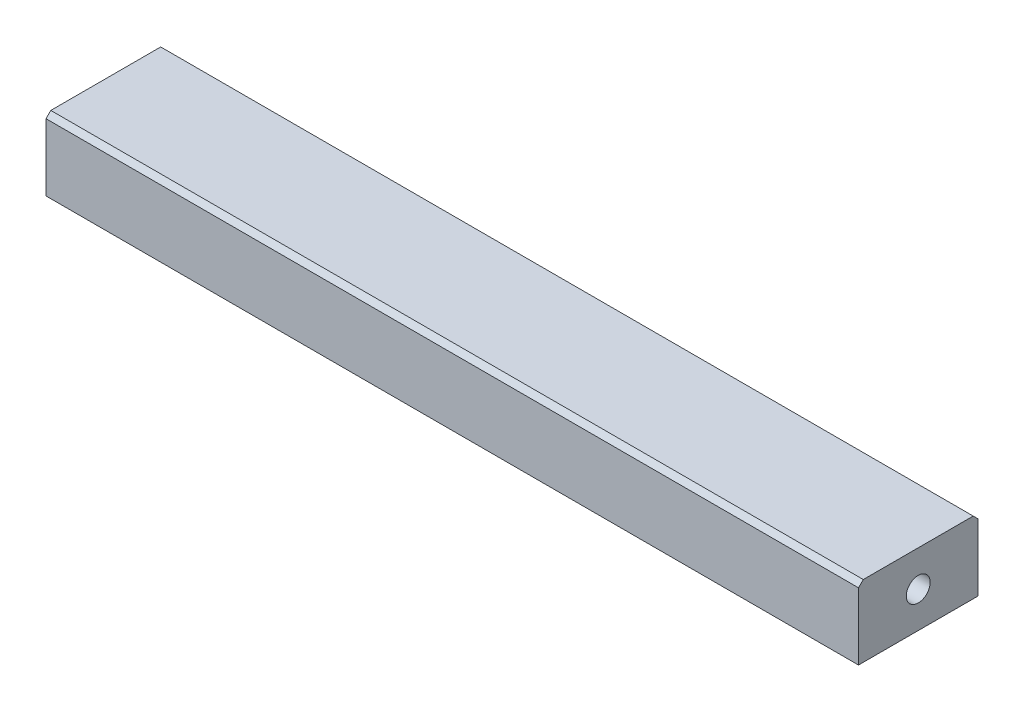
ISO-10303-21;
HEADER;
FILE_DESCRIPTION(('STEP AP214'),'2;1');
FILE_NAME('part.step','',(''),(''),'','','');
FILE_SCHEMA(('AUTOMOTIVE_DESIGN { 1 0 10303 214 1 1 1 1 }'));
ENDSEC;
DATA;
#1=APPLICATION_CONTEXT('core data for automotive mechanical design processes');
#2=APPLICATION_PROTOCOL_DEFINITION('international standard','automotive_design',2000,#1);
#3=PRODUCT_CONTEXT('',#1,'mechanical');
#4=PRODUCT('Part','Part','',(#3));
#5=PRODUCT_RELATED_PRODUCT_CATEGORY('part','',(#4));
#6=PRODUCT_DEFINITION_FORMATION('','',#4);
#7=PRODUCT_DEFINITION_CONTEXT('part definition',#1,'design');
#8=PRODUCT_DEFINITION('design','',#6,#7);
#9=PRODUCT_DEFINITION_SHAPE('','',#8);
#10=(LENGTH_UNIT() NAMED_UNIT(*) SI_UNIT(.MILLI.,.METRE.));
#11=(NAMED_UNIT(*) PLANE_ANGLE_UNIT() SI_UNIT($,.RADIAN.));
#12=(NAMED_UNIT(*) SI_UNIT($,.STERADIAN.) SOLID_ANGLE_UNIT());
#13=UNCERTAINTY_MEASURE_WITH_UNIT(LENGTH_MEASURE(1.E-05),#10,'distance_accuracy_value','');
#14=(GEOMETRIC_REPRESENTATION_CONTEXT(3) GLOBAL_UNCERTAINTY_ASSIGNED_CONTEXT((#13)) GLOBAL_UNIT_ASSIGNED_CONTEXT((#10,
#11,#12)) REPRESENTATION_CONTEXT('',''));
#15=CARTESIAN_POINT('',(0.,0.,0.));
#16=DIRECTION('',(0.,0.,1.));
#17=DIRECTION('',(1.,0.,0.));
#18=AXIS2_PLACEMENT_3D('',#15,#16,#17);
#19=CARTESIAN_POINT('',(-42.5,-3.75000000000001,12.5));
#20=DIRECTION('',(1.,0.,0.));
#21=DIRECTION('',(0.,0.,-1.));
#22=AXIS2_PLACEMENT_3D('',#19,#20,#21);
#23=PLANE('',#22);
#24=CARTESIAN_POINT('',(-42.5,0.,6.25));
#25=DIRECTION('',(1.,0.,0.));
#26=DIRECTION('',(0.,0.,-1.));
#27=AXIS2_PLACEMENT_3D('',#24,#25,#26);
#28=CIRCLE('',#27,1.25);
#29=CARTESIAN_POINT('',(-42.5,0.,5.));
#30=VERTEX_POINT('',#29);
#31=EDGE_CURVE('E157',#30,#30,#28,.T.);
#32=ORIENTED_EDGE('',*,*,#31,.T.);
#33=EDGE_LOOP('',(#32));
#34=FACE_BOUND('',#33,.T.);
#35=DIRECTION('',(0.,0.,-1.));
#36=VECTOR('',#35,1.);
#37=CARTESIAN_POINT('',(-42.5,3.74999999999999,12.5));
#38=LINE('',#37,#36);
#39=CARTESIAN_POINT('',(-42.5,3.74999999999999,12.));
#40=VERTEX_POINT('',#39);
#41=CARTESIAN_POINT('',(-42.5,3.74999999999999,0.5));
#42=VERTEX_POINT('',#41);
#43=EDGE_CURVE('E152',#40,#42,#38,.T.);
#44=ORIENTED_EDGE('',*,*,#43,.T.);
#45=DIRECTION('',(0.,0.707106781186548,0.707106781186548));
#46=VECTOR('',#45,1.);
#47=CARTESIAN_POINT('',(-42.5,3.75,0.500000000000006));
#48=LINE('',#47,#46);
#49=CARTESIAN_POINT('',(-42.5,3.24999999999999,0.));
#50=VERTEX_POINT('',#49);
#51=EDGE_CURVE('E135',#42,#50,#48,.F.);
#52=ORIENTED_EDGE('',*,*,#51,.T.);
#53=DIRECTION('',(0.,-1.,0.));
#54=VECTOR('',#53,1.);
#55=CARTESIAN_POINT('',(-42.5,-3.75000000000001,0.));
#56=LINE('',#55,#54);
#57=CARTESIAN_POINT('',(-42.5,-3.75000000000001,0.));
#58=VERTEX_POINT('',#57);
#59=EDGE_CURVE('E116',#50,#58,#56,.T.);
#60=ORIENTED_EDGE('',*,*,#59,.T.);
#61=DIRECTION('',(0.,0.,-1.));
#62=VECTOR('',#61,1.);
#63=CARTESIAN_POINT('',(-42.5,-3.75000000000001,12.5));
#64=LINE('',#63,#62);
#65=CARTESIAN_POINT('',(-42.5,-3.75000000000001,12.5));
#66=VERTEX_POINT('',#65);
#67=EDGE_CURVE('E109',#66,#58,#64,.T.);
#68=ORIENTED_EDGE('',*,*,#67,.F.);
#69=DIRECTION('',(0.,-1.,0.));
#70=VECTOR('',#69,1.);
#71=CARTESIAN_POINT('',(-42.5,-3.75000000000001,12.5));
#72=LINE('',#71,#70);
#73=CARTESIAN_POINT('',(-42.5,3.24999999999998,12.5));
#74=VERTEX_POINT('',#73);
#75=EDGE_CURVE('E95',#74,#66,#72,.T.);
#76=ORIENTED_EDGE('',*,*,#75,.F.);
#77=DIRECTION('',(0.,0.707106781186548,-0.707106781186548));
#78=VECTOR('',#77,1.);
#79=CARTESIAN_POINT('',(-42.5,3.24999999999999,12.5));
#80=LINE('',#79,#78);
#81=EDGE_CURVE('E132',#74,#40,#80,.T.);
#82=ORIENTED_EDGE('',*,*,#81,.T.);
#83=EDGE_LOOP('',(#44,#52,#60,#68,#76,#82));
#84=FACE_BOUND('',#83,.T.);
#85=ADVANCED_FACE('F38',(#34,#84),#23,.F.);
#86=CARTESIAN_POINT('',(42.5,-3.75,12.5));
#87=DIRECTION('',(0.,1.,0.));
#88=DIRECTION('',(-1.,0.,0.));
#89=AXIS2_PLACEMENT_3D('',#86,#87,#88);
#90=PLANE('',#89);
#91=DIRECTION('',(1.,0.,0.));
#92=VECTOR('',#91,1.);
#93=CARTESIAN_POINT('',(42.5,-3.75,0.));
#94=LINE('',#93,#92);
#95=CARTESIAN_POINT('',(42.5,-3.75,0.));
#96=VERTEX_POINT('',#95);
#97=EDGE_CURVE('E155',#58,#96,#94,.T.);
#98=ORIENTED_EDGE('',*,*,#97,.T.);
#99=DIRECTION('',(0.,0.,-1.));
#100=VECTOR('',#99,1.);
#101=CARTESIAN_POINT('',(42.5,-3.75,12.5));
#102=LINE('',#101,#100);
#103=CARTESIAN_POINT('',(42.5,-3.75,12.5));
#104=VERTEX_POINT('',#103);
#105=EDGE_CURVE('E111',#104,#96,#102,.T.);
#106=ORIENTED_EDGE('',*,*,#105,.F.);
#107=DIRECTION('',(1.,0.,0.));
#108=VECTOR('',#107,1.);
#109=CARTESIAN_POINT('',(42.5,-3.75,12.5));
#110=LINE('',#109,#108);
#111=EDGE_CURVE('E98',#66,#104,#110,.T.);
#112=ORIENTED_EDGE('',*,*,#111,.F.);
#113=ORIENTED_EDGE('',*,*,#67,.T.);
#114=EDGE_LOOP('',(#98,#106,#112,#113));
#115=FACE_BOUND('',#114,.T.);
#116=ADVANCED_FACE('F108',(#115),#90,.F.);
#117=CARTESIAN_POINT('',(42.5,-3.75,12.5));
#118=DIRECTION('',(-1.,0.,0.));
#119=DIRECTION('',(0.,0.,1.));
#120=AXIS2_PLACEMENT_3D('',#117,#118,#119);
#121=PLANE('',#120);
#122=CARTESIAN_POINT('',(42.5,0.,6.25));
#123=DIRECTION('',(1.,0.,0.));
#124=DIRECTION('',(0.,0.,-1.));
#125=AXIS2_PLACEMENT_3D('',#122,#123,#124);
#126=CIRCLE('',#125,1.25);
#127=CARTESIAN_POINT('',(42.5,0.,5.));
#128=VERTEX_POINT('',#127);
#129=EDGE_CURVE('E163',#128,#128,#126,.T.);
#130=ORIENTED_EDGE('',*,*,#129,.F.);
#131=EDGE_LOOP('',(#130));
#132=FACE_BOUND('',#131,.T.);
#133=DIRECTION('',(0.,1.,0.));
#134=VECTOR('',#133,1.);
#135=CARTESIAN_POINT('',(42.5,-3.75,0.));
#136=LINE('',#135,#134);
#137=CARTESIAN_POINT('',(42.5,3.25,0.));
#138=VERTEX_POINT('',#137);
#139=EDGE_CURVE('E104',#96,#138,#136,.T.);
#140=ORIENTED_EDGE('',*,*,#139,.T.);
#141=DIRECTION('',(0.,-0.707106781186548,-0.707106781186548));
#142=VECTOR('',#141,1.);
#143=CARTESIAN_POINT('',(42.5,3.75,0.5));
#144=LINE('',#143,#142);
#145=CARTESIAN_POINT('',(42.5,3.75,0.5));
#146=VERTEX_POINT('',#145);
#147=EDGE_CURVE('E47',#138,#146,#144,.F.);
#148=ORIENTED_EDGE('',*,*,#147,.T.);
#149=DIRECTION('',(0.,0.,-1.));
#150=VECTOR('',#149,1.);
#151=CARTESIAN_POINT('',(42.5,3.75,12.5));
#152=LINE('',#151,#150);
#153=CARTESIAN_POINT('',(42.5,3.75,12.));
#154=VERTEX_POINT('',#153);
#155=EDGE_CURVE('E125',#154,#146,#152,.T.);
#156=ORIENTED_EDGE('',*,*,#155,.F.);
#157=DIRECTION('',(0.,-0.707106781186548,0.707106781186548));
#158=VECTOR('',#157,1.);
#159=CARTESIAN_POINT('',(42.5,3.24999999999999,12.5));
#160=LINE('',#159,#158);
#161=CARTESIAN_POINT('',(42.5,3.25,12.5));
#162=VERTEX_POINT('',#161);
#163=EDGE_CURVE('E54',#154,#162,#160,.T.);
#164=ORIENTED_EDGE('',*,*,#163,.T.);
#165=DIRECTION('',(0.,1.,0.));
#166=VECTOR('',#165,1.);
#167=CARTESIAN_POINT('',(42.5,-3.75,12.5));
#168=LINE('',#167,#166);
#169=EDGE_CURVE('E113',#104,#162,#168,.T.);
#170=ORIENTED_EDGE('',*,*,#169,.F.);
#171=ORIENTED_EDGE('',*,*,#105,.T.);
#172=EDGE_LOOP('',(#140,#148,#156,#164,#170,#171));
#173=FACE_BOUND('',#172,.T.);
#174=ADVANCED_FACE('F144',(#132,#173),#121,.F.);
#175=CARTESIAN_POINT('',(42.5,3.75,12.5));
#176=DIRECTION('',(0.,-1.,0.));
#177=DIRECTION('',(1.,0.,0.));
#178=AXIS2_PLACEMENT_3D('',#175,#176,#177);
#179=PLANE('',#178);
#180=ORIENTED_EDGE('',*,*,#155,.T.);
#181=DIRECTION('',(-1.,0.,0.));
#182=VECTOR('',#181,1.);
#183=CARTESIAN_POINT('',(42.5,3.75,0.5));
#184=LINE('',#183,#182);
#185=EDGE_CURVE('E123',#146,#42,#184,.T.);
#186=ORIENTED_EDGE('',*,*,#185,.T.);
#187=ORIENTED_EDGE('',*,*,#43,.F.);
#188=DIRECTION('',(1.,0.,0.));
#189=VECTOR('',#188,1.);
#190=CARTESIAN_POINT('',(42.5,3.75,12.));
#191=LINE('',#190,#189);
#192=EDGE_CURVE('E119',#40,#154,#191,.T.);
#193=ORIENTED_EDGE('',*,*,#192,.T.);
#194=EDGE_LOOP('',(#180,#186,#187,#193));
#195=FACE_BOUND('',#194,.T.);
#196=ADVANCED_FACE('F148',(#195),#179,.F.);
#197=CARTESIAN_POINT('',(0.,0.,12.5));
#198=DIRECTION('',(0.,0.,1.));
#199=DIRECTION('',(1.,0.,0.));
#200=AXIS2_PLACEMENT_3D('',#197,#198,#199);
#201=PLANE('',#200);
#202=ORIENTED_EDGE('',*,*,#169,.T.);
#203=DIRECTION('',(-1.,0.,0.));
#204=VECTOR('',#203,1.);
#205=CARTESIAN_POINT('',(-42.5,3.24999999999998,12.5));
#206=LINE('',#205,#204);
#207=EDGE_CURVE('E11',#162,#74,#206,.T.);
#208=ORIENTED_EDGE('',*,*,#207,.T.);
#209=ORIENTED_EDGE('',*,*,#75,.T.);
#210=ORIENTED_EDGE('',*,*,#111,.T.);
#211=EDGE_LOOP('',(#202,#208,#209,#210));
#212=FACE_BOUND('',#211,.T.);
#213=ADVANCED_FACE('F97',(#212),#201,.T.);
#214=CARTESIAN_POINT('',(0.,0.,0.));
#215=DIRECTION('',(0.,0.,1.));
#216=DIRECTION('',(1.,0.,0.));
#217=AXIS2_PLACEMENT_3D('',#214,#215,#216);
#218=PLANE('',#217);
#219=ORIENTED_EDGE('',*,*,#59,.F.);
#220=DIRECTION('',(1.,0.,0.));
#221=VECTOR('',#220,1.);
#222=CARTESIAN_POINT('',(0.,3.25,0.));
#223=LINE('',#222,#221);
#224=EDGE_CURVE('E62',#50,#138,#223,.T.);
#225=ORIENTED_EDGE('',*,*,#224,.T.);
#226=ORIENTED_EDGE('',*,*,#139,.F.);
#227=ORIENTED_EDGE('',*,*,#97,.F.);
#228=EDGE_LOOP('',(#219,#225,#226,#227));
#229=FACE_BOUND('',#228,.T.);
#230=ADVANCED_FACE('F154',(#229),#218,.F.);
#231=CARTESIAN_POINT('',(-42.5,0.,6.25));
#232=DIRECTION('',(1.,0.,0.));
#233=DIRECTION('',(0.,0.,-1.));
#234=AXIS2_PLACEMENT_3D('',#231,#232,#233);
#235=CYLINDRICAL_SURFACE('',#234,1.25);
#236=ORIENTED_EDGE('',*,*,#31,.F.);
#237=EDGE_LOOP('',(#236));
#238=FACE_BOUND('',#237,.T.);
#239=ORIENTED_EDGE('',*,*,#129,.T.);
#240=EDGE_LOOP('',(#239));
#241=FACE_BOUND('',#240,.T.);
#242=ADVANCED_FACE('F176',(#238,#241),#235,.F.);
#243=CARTESIAN_POINT('',(42.5,3.75,0.5));
#244=DIRECTION('',(0.,-0.707106781186547,0.707106781186547));
#245=DIRECTION('',(-1.,0.,0.));
#246=AXIS2_PLACEMENT_3D('',#243,#244,#245);
#247=PLANE('',#246);
#248=ORIENTED_EDGE('',*,*,#147,.F.);
#249=ORIENTED_EDGE('',*,*,#224,.F.);
#250=ORIENTED_EDGE('',*,*,#51,.F.);
#251=ORIENTED_EDGE('',*,*,#185,.F.);
#252=EDGE_LOOP('',(#248,#249,#250,#251));
#253=FACE_BOUND('',#252,.T.);
#254=ADVANCED_FACE('F153',(#253),#247,.F.);
#255=CARTESIAN_POINT('',(0.,3.24999999999999,12.5));
#256=DIRECTION('',(0.,0.707106781186547,0.707106781186547));
#257=DIRECTION('',(1.,0.,0.));
#258=AXIS2_PLACEMENT_3D('',#255,#256,#257);
#259=PLANE('',#258);
#260=ORIENTED_EDGE('',*,*,#163,.F.);
#261=ORIENTED_EDGE('',*,*,#192,.F.);
#262=ORIENTED_EDGE('',*,*,#81,.F.);
#263=ORIENTED_EDGE('',*,*,#207,.F.);
#264=EDGE_LOOP('',(#260,#261,#262,#263));
#265=FACE_BOUND('',#264,.T.);
#266=ADVANCED_FACE('F40',(#265),#259,.T.);
#267=CLOSED_SHELL('',(#85,#116,#174,#196,#213,#230,#242,#254,#266));
#268=MANIFOLD_SOLID_BREP('B2',#267);
#269=ADVANCED_BREP_SHAPE_REPRESENTATION('',(#18,#268),#14);
#270=SHAPE_DEFINITION_REPRESENTATION(#9,#269);
ENDSEC;
END-ISO-10303-21;
